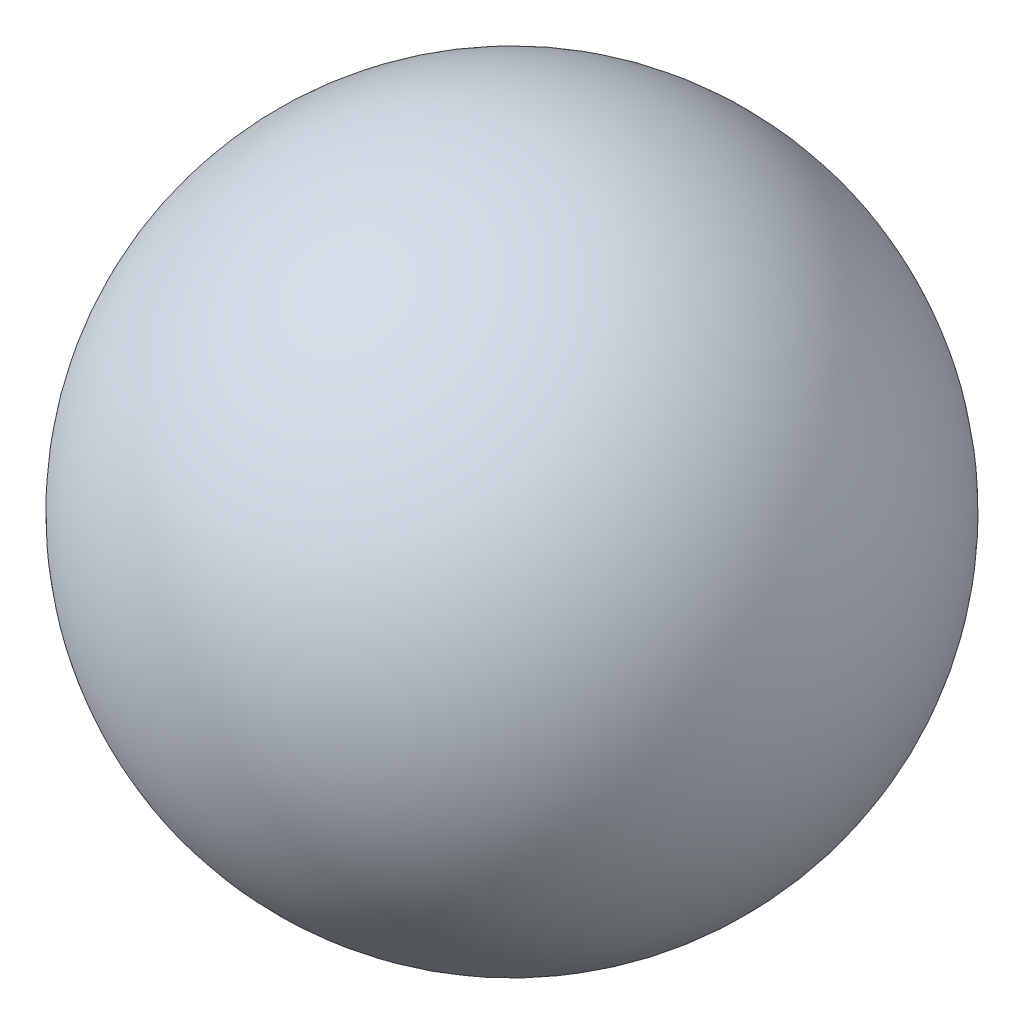
ISO-10303-21;
HEADER;
FILE_DESCRIPTION(('STEP AP214'),'2;1');
FILE_NAME('part.step','',(''),(''),'','','');
FILE_SCHEMA(('AUTOMOTIVE_DESIGN { 1 0 10303 214 1 1 1 1 }'));
ENDSEC;
DATA;
#1=APPLICATION_CONTEXT('core data for automotive mechanical design processes');
#2=APPLICATION_PROTOCOL_DEFINITION('international standard','automotive_design',2000,#1);
#3=PRODUCT_CONTEXT('',#1,'mechanical');
#4=PRODUCT('Part','Part','',(#3));
#5=PRODUCT_RELATED_PRODUCT_CATEGORY('part','',(#4));
#6=PRODUCT_DEFINITION_FORMATION('','',#4);
#7=PRODUCT_DEFINITION_CONTEXT('part definition',#1,'design');
#8=PRODUCT_DEFINITION('design','',#6,#7);
#9=PRODUCT_DEFINITION_SHAPE('','',#8);
#10=(LENGTH_UNIT() NAMED_UNIT(*) SI_UNIT(.MILLI.,.METRE.));
#11=(NAMED_UNIT(*) PLANE_ANGLE_UNIT() SI_UNIT($,.RADIAN.));
#12=(NAMED_UNIT(*) SI_UNIT($,.STERADIAN.) SOLID_ANGLE_UNIT());
#13=UNCERTAINTY_MEASURE_WITH_UNIT(LENGTH_MEASURE(1.E-05),#10,'distance_accuracy_value','');
#14=(GEOMETRIC_REPRESENTATION_CONTEXT(3) GLOBAL_UNCERTAINTY_ASSIGNED_CONTEXT((#13)) GLOBAL_UNIT_ASSIGNED_CONTEXT((#10,
#11,#12)) REPRESENTATION_CONTEXT('',''));
#15=CARTESIAN_POINT('',(0.,0.,0.));
#16=DIRECTION('',(0.,0.,1.));
#17=DIRECTION('',(1.,0.,0.));
#18=AXIS2_PLACEMENT_3D('',#15,#16,#17);
#19=CARTESIAN_POINT('',(0.,0.,0.));
#20=DIRECTION('',(0.,0.,-1.));
#21=DIRECTION('',(1.,0.,0.));
#22=AXIS2_PLACEMENT_3D('',#19,#20,#21);
#23=SPHERICAL_SURFACE('',#22,4.);
#24=CARTESIAN_POINT('',(0.,0.,-4.));
#25=VERTEX_POINT('',#24);
#26=VERTEX_LOOP('',#25);
#27=FACE_BOUND('',#26,.T.);
#28=ADVANCED_FACE('F33',(#27),#23,.T.);
#29=CLOSED_SHELL('',(#28));
#30=MANIFOLD_SOLID_BREP('B2',#29);
#31=ADVANCED_BREP_SHAPE_REPRESENTATION('',(#18,#30),#14);
#32=SHAPE_DEFINITION_REPRESENTATION(#9,#31);
ENDSEC;
END-ISO-10303-21;
